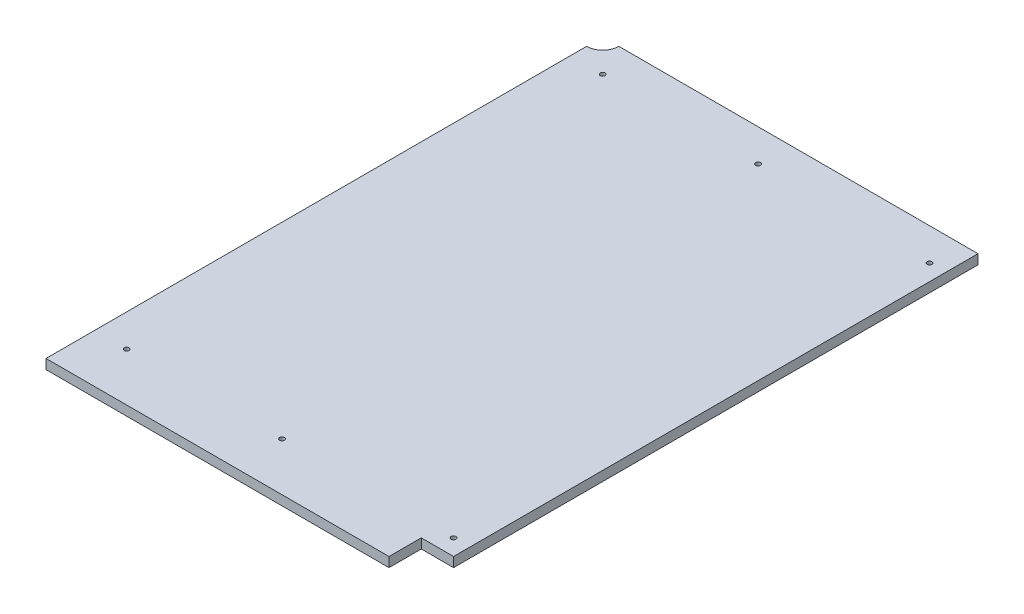
ISO-10303-21;
HEADER;
FILE_DESCRIPTION(('STEP AP214'),'2;1');
FILE_NAME('part.step','',(''),(''),'','','');
FILE_SCHEMA(('AUTOMOTIVE_DESIGN { 1 0 10303 214 1 1 1 1 }'));
ENDSEC;
DATA;
#1=APPLICATION_CONTEXT('core data for automotive mechanical design processes');
#2=APPLICATION_PROTOCOL_DEFINITION('international standard','automotive_design',2000,#1);
#3=PRODUCT_CONTEXT('',#1,'mechanical');
#4=PRODUCT('Part','Part','',(#3));
#5=PRODUCT_RELATED_PRODUCT_CATEGORY('part','',(#4));
#6=PRODUCT_DEFINITION_FORMATION('','',#4);
#7=PRODUCT_DEFINITION_CONTEXT('part definition',#1,'design');
#8=PRODUCT_DEFINITION('design','',#6,#7);
#9=PRODUCT_DEFINITION_SHAPE('','',#8);
#10=(LENGTH_UNIT() NAMED_UNIT(*) SI_UNIT(.MILLI.,.METRE.));
#11=(NAMED_UNIT(*) PLANE_ANGLE_UNIT() SI_UNIT($,.RADIAN.));
#12=(NAMED_UNIT(*) SI_UNIT($,.STERADIAN.) SOLID_ANGLE_UNIT());
#13=UNCERTAINTY_MEASURE_WITH_UNIT(LENGTH_MEASURE(1.E-05),#10,'distance_accuracy_value','');
#14=(GEOMETRIC_REPRESENTATION_CONTEXT(3) GLOBAL_UNCERTAINTY_ASSIGNED_CONTEXT((#13)) GLOBAL_UNIT_ASSIGNED_CONTEXT((#10,
#11,#12)) REPRESENTATION_CONTEXT('',''));
#15=CARTESIAN_POINT('',(0.,0.,0.));
#16=DIRECTION('',(0.,0.,1.));
#17=DIRECTION('',(1.,0.,0.));
#18=AXIS2_PLACEMENT_3D('',#15,#16,#17);
#19=CARTESIAN_POINT('',(-112.725,6.,-113.5));
#20=DIRECTION('',(0.,1.,0.));
#21=DIRECTION('',(0.,0.,1.));
#22=AXIS2_PLACEMENT_3D('',#19,#20,#21);
#23=PLANE('',#22);
#24=CARTESIAN_POINT('',(3.55000000000004,6.,201.5));
#25=DIRECTION('',(0.,1.,0.));
#26=DIRECTION('',(0.,0.,1.));
#27=AXIS2_PLACEMENT_3D('',#24,#25,#26);
#28=CIRCLE('',#27,1.5);
#29=CARTESIAN_POINT('',(3.55000000000004,6.,203.));
#30=VERTEX_POINT('',#29);
#31=EDGE_CURVE('E184',#30,#30,#28,.T.);
#32=ORIENTED_EDGE('',*,*,#31,.F.);
#33=EDGE_LOOP('',(#32));
#34=FACE_BOUND('',#33,.T.);
#35=CARTESIAN_POINT('',(3.55,6.,-93.5));
#36=DIRECTION('',(0.,1.,0.));
#37=DIRECTION('',(0.,0.,1.));
#38=AXIS2_PLACEMENT_3D('',#35,#36,#37);
#39=CIRCLE('',#38,1.5);
#40=CARTESIAN_POINT('',(3.55,6.,-92.));
#41=VERTEX_POINT('',#40);
#42=EDGE_CURVE('E172',#41,#41,#39,.T.);
#43=ORIENTED_EDGE('',*,*,#42,.F.);
#44=EDGE_LOOP('',(#43));
#45=FACE_BOUND('',#44,.T.);
#46=CARTESIAN_POINT('',(-92.725,6.,-93.5));
#47=DIRECTION('',(0.,1.,0.));
#48=DIRECTION('',(0.,0.,1.));
#49=AXIS2_PLACEMENT_3D('',#46,#47,#48);
#50=CIRCLE('',#49,1.5);
#51=CARTESIAN_POINT('',(-92.725,6.,-92.));
#52=VERTEX_POINT('',#51);
#53=EDGE_CURVE('E130',#52,#52,#50,.T.);
#54=ORIENTED_EDGE('',*,*,#53,.F.);
#55=EDGE_LOOP('',(#54));
#56=FACE_BOUND('',#55,.T.);
#57=DIRECTION('',(1.,0.,0.));
#58=VECTOR('',#57,1.);
#59=CARTESIAN_POINT('',(-112.725,6.,231.5));
#60=LINE('',#59,#58);
#61=CARTESIAN_POINT('',(-112.725,6.,231.5));
#62=VERTEX_POINT('',#61);
#63=CARTESIAN_POINT('',(99.825,6.,231.5));
#64=VERTEX_POINT('',#63);
#65=EDGE_CURVE('E139',#62,#64,#60,.T.);
#66=ORIENTED_EDGE('',*,*,#65,.T.);
#67=DIRECTION('',(0.,0.,-1.));
#68=VECTOR('',#67,1.);
#69=CARTESIAN_POINT('',(99.825,6.,231.5));
#70=LINE('',#69,#68);
#71=CARTESIAN_POINT('',(99.825,6.,211.5));
#72=VERTEX_POINT('',#71);
#73=EDGE_CURVE('E92',#64,#72,#70,.T.);
#74=ORIENTED_EDGE('',*,*,#73,.T.);
#75=DIRECTION('',(1.,0.,0.));
#76=VECTOR('',#75,1.);
#77=CARTESIAN_POINT('',(99.825,6.,211.5));
#78=LINE('',#77,#76);
#79=CARTESIAN_POINT('',(119.825,6.,211.5));
#80=VERTEX_POINT('',#79);
#81=EDGE_CURVE('E151',#72,#80,#78,.T.);
#82=ORIENTED_EDGE('',*,*,#81,.T.);
#83=DIRECTION('',(0.,0.,-1.));
#84=VECTOR('',#83,1.);
#85=CARTESIAN_POINT('',(119.825,6.,-113.5));
#86=LINE('',#85,#84);
#87=CARTESIAN_POINT('',(119.825,6.,-113.5));
#88=VERTEX_POINT('',#87);
#89=EDGE_CURVE('E108',#80,#88,#86,.T.);
#90=ORIENTED_EDGE('',*,*,#89,.T.);
#91=DIRECTION('',(-1.,0.,0.));
#92=VECTOR('',#91,1.);
#93=CARTESIAN_POINT('',(-102.725,6.,-113.5));
#94=LINE('',#93,#92);
#95=CARTESIAN_POINT('',(-102.725,6.,-113.5));
#96=VERTEX_POINT('',#95);
#97=EDGE_CURVE('E102',#88,#96,#94,.T.);
#98=ORIENTED_EDGE('',*,*,#97,.T.);
#99=CARTESIAN_POINT('',(-112.725,6.,-113.5));
#100=DIRECTION('',(0.,-1.,0.));
#101=DIRECTION('',(0.,0.,1.));
#102=AXIS2_PLACEMENT_3D('',#99,#100,#101);
#103=CIRCLE('',#102,9.99999999999999);
#104=CARTESIAN_POINT('',(-112.725,6.,-103.5));
#105=VERTEX_POINT('',#104);
#106=EDGE_CURVE('E106',#96,#105,#103,.T.);
#107=ORIENTED_EDGE('',*,*,#106,.T.);
#108=DIRECTION('',(0.,0.,1.));
#109=VECTOR('',#108,1.);
#110=CARTESIAN_POINT('',(-112.725,6.,-103.5));
#111=LINE('',#110,#109);
#112=EDGE_CURVE('E52',#105,#62,#111,.T.);
#113=ORIENTED_EDGE('',*,*,#112,.T.);
#114=EDGE_LOOP('',(#66,#74,#82,#90,#98,#107,#113));
#115=FACE_BOUND('',#114,.T.);
#116=CARTESIAN_POINT('',(109.825,6.,-93.5));
#117=DIRECTION('',(0.,1.,0.));
#118=DIRECTION('',(0.,0.,1.));
#119=AXIS2_PLACEMENT_3D('',#116,#117,#118);
#120=CIRCLE('',#119,1.5);
#121=CARTESIAN_POINT('',(109.825,6.,-92.));
#122=VERTEX_POINT('',#121);
#123=EDGE_CURVE('E166',#122,#122,#120,.T.);
#124=ORIENTED_EDGE('',*,*,#123,.F.);
#125=EDGE_LOOP('',(#124));
#126=FACE_BOUND('',#125,.T.);
#127=CARTESIAN_POINT('',(-92.725,6.,201.5));
#128=DIRECTION('',(0.,1.,0.));
#129=DIRECTION('',(0.,0.,1.));
#130=AXIS2_PLACEMENT_3D('',#127,#128,#129);
#131=CIRCLE('',#130,1.5);
#132=CARTESIAN_POINT('',(-92.725,6.,203.));
#133=VERTEX_POINT('',#132);
#134=EDGE_CURVE('E178',#133,#133,#131,.T.);
#135=ORIENTED_EDGE('',*,*,#134,.F.);
#136=EDGE_LOOP('',(#135));
#137=FACE_BOUND('',#136,.T.);
#138=CARTESIAN_POINT('',(109.825,6.,201.5));
#139=DIRECTION('',(0.,1.,0.));
#140=DIRECTION('',(0.,0.,1.));
#141=AXIS2_PLACEMENT_3D('',#138,#139,#140);
#142=CIRCLE('',#141,1.5);
#143=CARTESIAN_POINT('',(109.825,6.,203.));
#144=VERTEX_POINT('',#143);
#145=EDGE_CURVE('E190',#144,#144,#142,.T.);
#146=ORIENTED_EDGE('',*,*,#145,.F.);
#147=EDGE_LOOP('',(#146));
#148=FACE_BOUND('',#147,.T.);
#149=ADVANCED_FACE('F35',(#34,#45,#56,#115,#126,#137,#148),#23,.T.);
#150=CARTESIAN_POINT('',(-112.725,0.,-113.5));
#151=DIRECTION('',(0.,1.,0.));
#152=DIRECTION('',(0.,0.,1.));
#153=AXIS2_PLACEMENT_3D('',#150,#151,#152);
#154=PLANE('',#153);
#155=DIRECTION('',(1.,0.,0.));
#156=VECTOR('',#155,1.);
#157=CARTESIAN_POINT('',(-112.725,0.,231.5));
#158=LINE('',#157,#156);
#159=CARTESIAN_POINT('',(-112.725,0.,231.5));
#160=VERTEX_POINT('',#159);
#161=CARTESIAN_POINT('',(99.825,0.,231.5));
#162=VERTEX_POINT('',#161);
#163=EDGE_CURVE('E126',#160,#162,#158,.T.);
#164=ORIENTED_EDGE('',*,*,#163,.F.);
#165=DIRECTION('',(0.,0.,1.));
#166=VECTOR('',#165,1.);
#167=CARTESIAN_POINT('',(-112.725,0.,-103.5));
#168=LINE('',#167,#166);
#169=CARTESIAN_POINT('',(-112.725,0.,-103.5));
#170=VERTEX_POINT('',#169);
#171=EDGE_CURVE('E84',#170,#160,#168,.T.);
#172=ORIENTED_EDGE('',*,*,#171,.F.);
#173=CARTESIAN_POINT('',(-112.725,0.,-113.5));
#174=DIRECTION('',(0.,-1.,0.));
#175=DIRECTION('',(0.,0.,1.));
#176=AXIS2_PLACEMENT_3D('',#173,#174,#175);
#177=CIRCLE('',#176,9.99999999999999);
#178=CARTESIAN_POINT('',(-102.725,0.,-113.5));
#179=VERTEX_POINT('',#178);
#180=EDGE_CURVE('E78',#179,#170,#177,.T.);
#181=ORIENTED_EDGE('',*,*,#180,.F.);
#182=DIRECTION('',(-1.,0.,0.));
#183=VECTOR('',#182,1.);
#184=CARTESIAN_POINT('',(-102.725,0.,-113.5));
#185=LINE('',#184,#183);
#186=CARTESIAN_POINT('',(119.825,0.,-113.5));
#187=VERTEX_POINT('',#186);
#188=EDGE_CURVE('E116',#187,#179,#185,.T.);
#189=ORIENTED_EDGE('',*,*,#188,.F.);
#190=DIRECTION('',(0.,0.,-1.));
#191=VECTOR('',#190,1.);
#192=CARTESIAN_POINT('',(119.825,0.,-113.5));
#193=LINE('',#192,#191);
#194=CARTESIAN_POINT('',(119.825,0.,211.5));
#195=VERTEX_POINT('',#194);
#196=EDGE_CURVE('E134',#195,#187,#193,.T.);
#197=ORIENTED_EDGE('',*,*,#196,.F.);
#198=DIRECTION('',(1.,0.,0.));
#199=VECTOR('',#198,1.);
#200=CARTESIAN_POINT('',(99.825,0.,211.5));
#201=LINE('',#200,#199);
#202=CARTESIAN_POINT('',(99.825,0.,211.5));
#203=VERTEX_POINT('',#202);
#204=EDGE_CURVE('E132',#203,#195,#201,.T.);
#205=ORIENTED_EDGE('',*,*,#204,.F.);
#206=DIRECTION('',(0.,0.,-1.));
#207=VECTOR('',#206,1.);
#208=CARTESIAN_POINT('',(99.825,0.,231.5));
#209=LINE('',#208,#207);
#210=EDGE_CURVE('E129',#162,#203,#209,.T.);
#211=ORIENTED_EDGE('',*,*,#210,.F.);
#212=EDGE_LOOP('',(#164,#172,#181,#189,#197,#205,#211));
#213=FACE_BOUND('',#212,.T.);
#214=CARTESIAN_POINT('',(-92.725,0.,-93.5));
#215=DIRECTION('',(0.,1.,0.));
#216=DIRECTION('',(0.,0.,1.));
#217=AXIS2_PLACEMENT_3D('',#214,#215,#216);
#218=CIRCLE('',#217,1.5);
#219=CARTESIAN_POINT('',(-92.725,0.,-92.));
#220=VERTEX_POINT('',#219);
#221=EDGE_CURVE('E163',#220,#220,#218,.T.);
#222=ORIENTED_EDGE('',*,*,#221,.T.);
#223=EDGE_LOOP('',(#222));
#224=FACE_BOUND('',#223,.T.);
#225=CARTESIAN_POINT('',(109.825,0.,-93.5));
#226=DIRECTION('',(0.,1.,0.));
#227=DIRECTION('',(0.,0.,1.));
#228=AXIS2_PLACEMENT_3D('',#225,#226,#227);
#229=CIRCLE('',#228,1.5);
#230=CARTESIAN_POINT('',(109.825,0.,-92.));
#231=VERTEX_POINT('',#230);
#232=EDGE_CURVE('E169',#231,#231,#229,.T.);
#233=ORIENTED_EDGE('',*,*,#232,.T.);
#234=EDGE_LOOP('',(#233));
#235=FACE_BOUND('',#234,.T.);
#236=CARTESIAN_POINT('',(3.55,0.,-93.5));
#237=DIRECTION('',(0.,1.,0.));
#238=DIRECTION('',(0.,0.,1.));
#239=AXIS2_PLACEMENT_3D('',#236,#237,#238);
#240=CIRCLE('',#239,1.5);
#241=CARTESIAN_POINT('',(3.55,0.,-92.));
#242=VERTEX_POINT('',#241);
#243=EDGE_CURVE('E175',#242,#242,#240,.T.);
#244=ORIENTED_EDGE('',*,*,#243,.T.);
#245=EDGE_LOOP('',(#244));
#246=FACE_BOUND('',#245,.T.);
#247=CARTESIAN_POINT('',(-92.725,0.,201.5));
#248=DIRECTION('',(0.,1.,0.));
#249=DIRECTION('',(0.,0.,1.));
#250=AXIS2_PLACEMENT_3D('',#247,#248,#249);
#251=CIRCLE('',#250,1.5);
#252=CARTESIAN_POINT('',(-92.725,0.,203.));
#253=VERTEX_POINT('',#252);
#254=EDGE_CURVE('E181',#253,#253,#251,.T.);
#255=ORIENTED_EDGE('',*,*,#254,.T.);
#256=EDGE_LOOP('',(#255));
#257=FACE_BOUND('',#256,.T.);
#258=CARTESIAN_POINT('',(3.55000000000004,0.,201.5));
#259=DIRECTION('',(0.,1.,0.));
#260=DIRECTION('',(0.,0.,1.));
#261=AXIS2_PLACEMENT_3D('',#258,#259,#260);
#262=CIRCLE('',#261,1.5);
#263=CARTESIAN_POINT('',(3.55000000000004,0.,203.));
#264=VERTEX_POINT('',#263);
#265=EDGE_CURVE('E187',#264,#264,#262,.T.);
#266=ORIENTED_EDGE('',*,*,#265,.T.);
#267=EDGE_LOOP('',(#266));
#268=FACE_BOUND('',#267,.T.);
#269=CARTESIAN_POINT('',(109.825,0.,201.5));
#270=DIRECTION('',(0.,1.,0.));
#271=DIRECTION('',(0.,0.,1.));
#272=AXIS2_PLACEMENT_3D('',#269,#270,#271);
#273=CIRCLE('',#272,1.5);
#274=CARTESIAN_POINT('',(109.825,0.,203.));
#275=VERTEX_POINT('',#274);
#276=EDGE_CURVE('E193',#275,#275,#273,.T.);
#277=ORIENTED_EDGE('',*,*,#276,.T.);
#278=EDGE_LOOP('',(#277));
#279=FACE_BOUND('',#278,.T.);
#280=ADVANCED_FACE('F155',(#213,#224,#235,#246,#257,#268,#279),#154,.F.);
#281=CARTESIAN_POINT('',(-112.725,6.,231.5));
#282=DIRECTION('',(0.,0.,-1.));
#283=DIRECTION('',(-1.,0.,0.));
#284=AXIS2_PLACEMENT_3D('',#281,#282,#283);
#285=PLANE('',#284);
#286=ORIENTED_EDGE('',*,*,#163,.T.);
#287=DIRECTION('',(0.,-1.,0.));
#288=VECTOR('',#287,1.);
#289=CARTESIAN_POINT('',(99.825,6.,231.5));
#290=LINE('',#289,#288);
#291=EDGE_CURVE('E11',#64,#162,#290,.T.);
#292=ORIENTED_EDGE('',*,*,#291,.F.);
#293=ORIENTED_EDGE('',*,*,#65,.F.);
#294=DIRECTION('',(0.,-1.,0.));
#295=VECTOR('',#294,1.);
#296=CARTESIAN_POINT('',(-112.725,6.,231.5));
#297=LINE('',#296,#295);
#298=EDGE_CURVE('E122',#62,#160,#297,.T.);
#299=ORIENTED_EDGE('',*,*,#298,.T.);
#300=EDGE_LOOP('',(#286,#292,#293,#299));
#301=FACE_BOUND('',#300,.T.);
#302=ADVANCED_FACE('F37',(#301),#285,.F.);
#303=CARTESIAN_POINT('',(99.825,6.,231.5));
#304=DIRECTION('',(-1.,0.,0.));
#305=DIRECTION('',(0.,0.,1.));
#306=AXIS2_PLACEMENT_3D('',#303,#304,#305);
#307=PLANE('',#306);
#308=ORIENTED_EDGE('',*,*,#210,.T.);
#309=DIRECTION('',(0.,-1.,0.));
#310=VECTOR('',#309,1.);
#311=CARTESIAN_POINT('',(99.825,6.,211.5));
#312=LINE('',#311,#310);
#313=EDGE_CURVE('E44',#72,#203,#312,.T.);
#314=ORIENTED_EDGE('',*,*,#313,.F.);
#315=ORIENTED_EDGE('',*,*,#73,.F.);
#316=ORIENTED_EDGE('',*,*,#291,.T.);
#317=EDGE_LOOP('',(#308,#314,#315,#316));
#318=FACE_BOUND('',#317,.T.);
#319=ADVANCED_FACE('F225',(#318),#307,.F.);
#320=CARTESIAN_POINT('',(99.825,6.,211.5));
#321=DIRECTION('',(0.,0.,-1.));
#322=DIRECTION('',(-1.,0.,0.));
#323=AXIS2_PLACEMENT_3D('',#320,#321,#322);
#324=PLANE('',#323);
#325=ORIENTED_EDGE('',*,*,#204,.T.);
#326=DIRECTION('',(0.,-1.,0.));
#327=VECTOR('',#326,1.);
#328=CARTESIAN_POINT('',(119.825,6.,211.5));
#329=LINE('',#328,#327);
#330=EDGE_CURVE('E143',#80,#195,#329,.T.);
#331=ORIENTED_EDGE('',*,*,#330,.F.);
#332=ORIENTED_EDGE('',*,*,#81,.F.);
#333=ORIENTED_EDGE('',*,*,#313,.T.);
#334=EDGE_LOOP('',(#325,#331,#332,#333));
#335=FACE_BOUND('',#334,.T.);
#336=ADVANCED_FACE('F149',(#335),#324,.F.);
#337=CARTESIAN_POINT('',(119.825,6.,-113.5));
#338=DIRECTION('',(-1.,0.,0.));
#339=DIRECTION('',(0.,0.,1.));
#340=AXIS2_PLACEMENT_3D('',#337,#338,#339);
#341=PLANE('',#340);
#342=ORIENTED_EDGE('',*,*,#196,.T.);
#343=DIRECTION('',(0.,-1.,0.));
#344=VECTOR('',#343,1.);
#345=CARTESIAN_POINT('',(119.825,6.,-113.5));
#346=LINE('',#345,#344);
#347=EDGE_CURVE('E117',#88,#187,#346,.T.);
#348=ORIENTED_EDGE('',*,*,#347,.F.);
#349=ORIENTED_EDGE('',*,*,#89,.F.);
#350=ORIENTED_EDGE('',*,*,#330,.T.);
#351=EDGE_LOOP('',(#342,#348,#349,#350));
#352=FACE_BOUND('',#351,.T.);
#353=ADVANCED_FACE('F158',(#352),#341,.F.);
#354=CARTESIAN_POINT('',(-102.725,6.,-113.5));
#355=DIRECTION('',(0.,0.,1.));
#356=DIRECTION('',(1.,0.,0.));
#357=AXIS2_PLACEMENT_3D('',#354,#355,#356);
#358=PLANE('',#357);
#359=ORIENTED_EDGE('',*,*,#188,.T.);
#360=DIRECTION('',(0.,-1.,0.));
#361=VECTOR('',#360,1.);
#362=CARTESIAN_POINT('',(-102.725,6.,-113.5));
#363=LINE('',#362,#361);
#364=EDGE_CURVE('E113',#96,#179,#363,.T.);
#365=ORIENTED_EDGE('',*,*,#364,.F.);
#366=ORIENTED_EDGE('',*,*,#97,.F.);
#367=ORIENTED_EDGE('',*,*,#347,.T.);
#368=EDGE_LOOP('',(#359,#365,#366,#367));
#369=FACE_BOUND('',#368,.T.);
#370=ADVANCED_FACE('F114',(#369),#358,.F.);
#371=CARTESIAN_POINT('',(-112.725,6.,-113.5));
#372=DIRECTION('',(0.,-1.,0.));
#373=DIRECTION('',(0.,0.,-1.));
#374=AXIS2_PLACEMENT_3D('',#371,#372,#373);
#375=CYLINDRICAL_SURFACE('',#374,9.99999999999999);
#376=ORIENTED_EDGE('',*,*,#180,.T.);
#377=DIRECTION('',(0.,-1.,0.));
#378=VECTOR('',#377,1.);
#379=CARTESIAN_POINT('',(-112.725,6.,-103.5));
#380=LINE('',#379,#378);
#381=EDGE_CURVE('E118',#105,#170,#380,.T.);
#382=ORIENTED_EDGE('',*,*,#381,.F.);
#383=ORIENTED_EDGE('',*,*,#106,.F.);
#384=ORIENTED_EDGE('',*,*,#364,.T.);
#385=EDGE_LOOP('',(#376,#382,#383,#384));
#386=FACE_BOUND('',#385,.T.);
#387=ADVANCED_FACE('F120',(#386),#375,.F.);
#388=CARTESIAN_POINT('',(-112.725,6.,-103.5));
#389=DIRECTION('',(1.,0.,0.));
#390=DIRECTION('',(0.,0.,-1.));
#391=AXIS2_PLACEMENT_3D('',#388,#389,#390);
#392=PLANE('',#391);
#393=ORIENTED_EDGE('',*,*,#171,.T.);
#394=ORIENTED_EDGE('',*,*,#298,.F.);
#395=ORIENTED_EDGE('',*,*,#112,.F.);
#396=ORIENTED_EDGE('',*,*,#381,.T.);
#397=EDGE_LOOP('',(#393,#394,#395,#396));
#398=FACE_BOUND('',#397,.T.);
#399=ADVANCED_FACE('F215',(#398),#392,.F.);
#400=CARTESIAN_POINT('',(-92.725,6.,-93.5));
#401=DIRECTION('',(0.,-1.,0.));
#402=DIRECTION('',(0.,0.,-1.));
#403=AXIS2_PLACEMENT_3D('',#400,#401,#402);
#404=CYLINDRICAL_SURFACE('',#403,1.5);
#405=ORIENTED_EDGE('',*,*,#53,.T.);
#406=EDGE_LOOP('',(#405));
#407=FACE_BOUND('',#406,.T.);
#408=ORIENTED_EDGE('',*,*,#221,.F.);
#409=EDGE_LOOP('',(#408));
#410=FACE_BOUND('',#409,.T.);
#411=ADVANCED_FACE('F212',(#407,#410),#404,.F.);
#412=CARTESIAN_POINT('',(109.825,6.,-93.5));
#413=DIRECTION('',(0.,-1.,0.));
#414=DIRECTION('',(0.,0.,-1.));
#415=AXIS2_PLACEMENT_3D('',#412,#413,#414);
#416=CYLINDRICAL_SURFACE('',#415,1.5);
#417=ORIENTED_EDGE('',*,*,#123,.T.);
#418=EDGE_LOOP('',(#417));
#419=FACE_BOUND('',#418,.T.);
#420=ORIENTED_EDGE('',*,*,#232,.F.);
#421=EDGE_LOOP('',(#420));
#422=FACE_BOUND('',#421,.T.);
#423=ADVANCED_FACE('F284',(#419,#422),#416,.F.);
#424=CARTESIAN_POINT('',(3.55,6.,-93.5));
#425=DIRECTION('',(0.,-1.,0.));
#426=DIRECTION('',(0.,0.,-1.));
#427=AXIS2_PLACEMENT_3D('',#424,#425,#426);
#428=CYLINDRICAL_SURFACE('',#427,1.5);
#429=ORIENTED_EDGE('',*,*,#42,.T.);
#430=EDGE_LOOP('',(#429));
#431=FACE_BOUND('',#430,.T.);
#432=ORIENTED_EDGE('',*,*,#243,.F.);
#433=EDGE_LOOP('',(#432));
#434=FACE_BOUND('',#433,.T.);
#435=ADVANCED_FACE('F292',(#431,#434),#428,.F.);
#436=CARTESIAN_POINT('',(-92.725,6.,201.5));
#437=DIRECTION('',(0.,-1.,0.));
#438=DIRECTION('',(0.,0.,-1.));
#439=AXIS2_PLACEMENT_3D('',#436,#437,#438);
#440=CYLINDRICAL_SURFACE('',#439,1.5);
#441=ORIENTED_EDGE('',*,*,#134,.T.);
#442=EDGE_LOOP('',(#441));
#443=FACE_BOUND('',#442,.T.);
#444=ORIENTED_EDGE('',*,*,#254,.F.);
#445=EDGE_LOOP('',(#444));
#446=FACE_BOUND('',#445,.T.);
#447=ADVANCED_FACE('F300',(#443,#446),#440,.F.);
#448=CARTESIAN_POINT('',(3.55000000000004,6.,201.5));
#449=DIRECTION('',(0.,-1.,0.));
#450=DIRECTION('',(0.,0.,-1.));
#451=AXIS2_PLACEMENT_3D('',#448,#449,#450);
#452=CYLINDRICAL_SURFACE('',#451,1.5);
#453=ORIENTED_EDGE('',*,*,#31,.T.);
#454=EDGE_LOOP('',(#453));
#455=FACE_BOUND('',#454,.T.);
#456=ORIENTED_EDGE('',*,*,#265,.F.);
#457=EDGE_LOOP('',(#456));
#458=FACE_BOUND('',#457,.T.);
#459=ADVANCED_FACE('F309',(#455,#458),#452,.F.);
#460=CARTESIAN_POINT('',(109.825,6.,201.5));
#461=DIRECTION('',(0.,-1.,0.));
#462=DIRECTION('',(0.,0.,-1.));
#463=AXIS2_PLACEMENT_3D('',#460,#461,#462);
#464=CYLINDRICAL_SURFACE('',#463,1.5);
#465=ORIENTED_EDGE('',*,*,#145,.T.);
#466=EDGE_LOOP('',(#465));
#467=FACE_BOUND('',#466,.T.);
#468=ORIENTED_EDGE('',*,*,#276,.F.);
#469=EDGE_LOOP('',(#468));
#470=FACE_BOUND('',#469,.T.);
#471=ADVANCED_FACE('F199',(#467,#470),#464,.F.);
#472=CLOSED_SHELL('',(#149,#280,#302,#319,#336,#353,#370,#387,#399,#411,#423,#435,#447,#459,#471));
#473=MANIFOLD_SOLID_BREP('B2',#472);
#474=ADVANCED_BREP_SHAPE_REPRESENTATION('',(#18,#473),#14);
#475=SHAPE_DEFINITION_REPRESENTATION(#9,#474);
ENDSEC;
END-ISO-10303-21;
